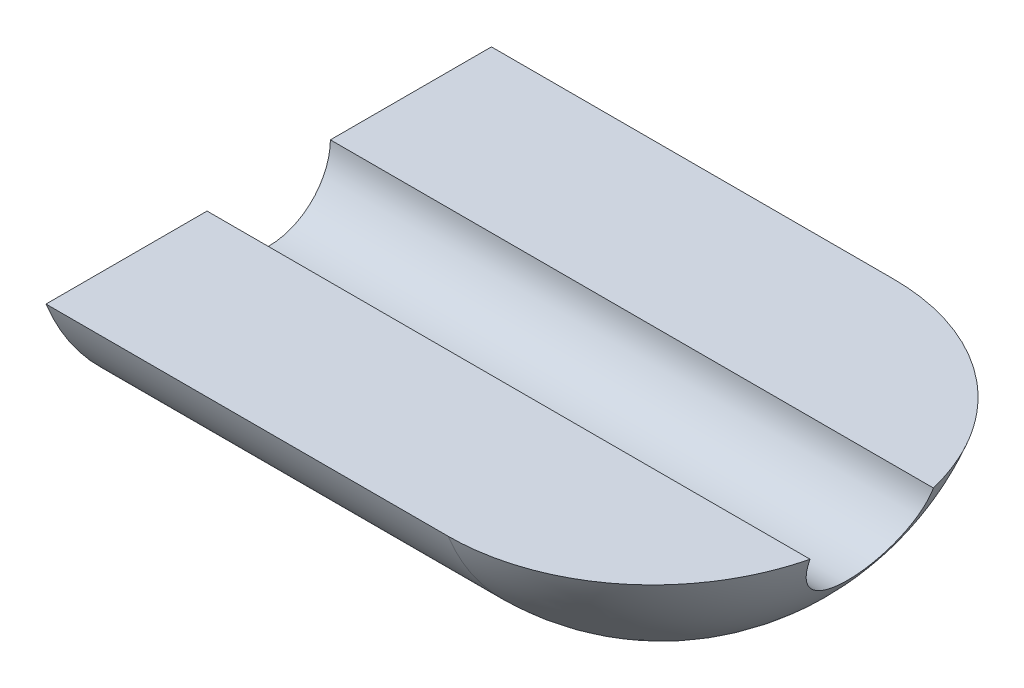
ISO-10303-21;
HEADER;
FILE_DESCRIPTION(('STEP AP214'),'2;1');
FILE_NAME('part.step','',(''),(''),'','','');
FILE_SCHEMA(('AUTOMOTIVE_DESIGN { 1 0 10303 214 1 1 1 1 }'));
ENDSEC;
DATA;
#1=APPLICATION_CONTEXT('core data for automotive mechanical design processes');
#2=APPLICATION_PROTOCOL_DEFINITION('international standard','automotive_design',2000,#1);
#3=PRODUCT_CONTEXT('',#1,'mechanical');
#4=PRODUCT('Part','Part','',(#3));
#5=PRODUCT_RELATED_PRODUCT_CATEGORY('part','',(#4));
#6=PRODUCT_DEFINITION_FORMATION('','',#4);
#7=PRODUCT_DEFINITION_CONTEXT('part definition',#1,'design');
#8=PRODUCT_DEFINITION('design','',#6,#7);
#9=PRODUCT_DEFINITION_SHAPE('','',#8);
#10=(LENGTH_UNIT() NAMED_UNIT(*) SI_UNIT(.MILLI.,.METRE.));
#11=(NAMED_UNIT(*) PLANE_ANGLE_UNIT() SI_UNIT($,.RADIAN.));
#12=(NAMED_UNIT(*) SI_UNIT($,.STERADIAN.) SOLID_ANGLE_UNIT());
#13=UNCERTAINTY_MEASURE_WITH_UNIT(LENGTH_MEASURE(1.E-05),#10,'distance_accuracy_value','');
#14=(GEOMETRIC_REPRESENTATION_CONTEXT(3) GLOBAL_UNCERTAINTY_ASSIGNED_CONTEXT((#13)) GLOBAL_UNIT_ASSIGNED_CONTEXT((#10,
#11,#12)) REPRESENTATION_CONTEXT('',''));
#15=CARTESIAN_POINT('',(0.,0.,0.));
#16=DIRECTION('',(0.,0.,1.));
#17=DIRECTION('',(1.,0.,0.));
#18=AXIS2_PLACEMENT_3D('',#15,#16,#17);
#19=CARTESIAN_POINT('',(0.,5.5,0.));
#20=DIRECTION('',(0.,1.,0.));
#21=DIRECTION('',(0.,0.,1.));
#22=AXIS2_PLACEMENT_3D('',#19,#20,#21);
#23=PLANE('',#22);
#24=DIRECTION('',(-1.,0.,0.));
#25=VECTOR('',#24,1.);
#26=CARTESIAN_POINT('',(80.01,5.5,0.634581549236986));
#27=LINE('',#26,#25);
#28=CARTESIAN_POINT('',(57.34,5.5,0.634581549236986));
#29=VERTEX_POINT('',#28);
#30=CARTESIAN_POINT('',(72.01,5.5,0.634581549236986));
#31=VERTEX_POINT('',#30);
#32=EDGE_CURVE('E101',#29,#31,#27,.F.);
#33=ORIENTED_EDGE('',*,*,#32,.F.);
#34=DIRECTION('',(0.,0.,1.));
#35=VECTOR('',#34,1.);
#36=CARTESIAN_POINT('',(57.34,5.5,17.52));
#37=LINE('',#36,#35);
#38=CARTESIAN_POINT('',(57.34,5.5,6.51005000055557));
#39=VERTEX_POINT('',#38);
#40=EDGE_CURVE('E96',#29,#39,#37,.T.);
#41=ORIENTED_EDGE('',*,*,#40,.T.);
#42=DIRECTION('',(-1.,0.,0.));
#43=VECTOR('',#42,1.);
#44=CARTESIAN_POINT('',(80.01,5.5,6.51005000055557));
#45=LINE('',#44,#43);
#46=CARTESIAN_POINT('',(79.3394800276012,5.50000000000008,6.51005000055557));
#47=VERTEX_POINT('',#46);
#48=EDGE_CURVE('E88',#39,#47,#45,.F.);
#49=ORIENTED_EDGE('',*,*,#48,.T.);
#50=CARTESIAN_POINT('',(79.6076953742566,5.5,8.76));
#51=CARTESIAN_POINT('',(79.6077023309361,5.5,9.02837036371126));
#52=CARTESIAN_POINT('',(79.5968199968479,5.5,9.29679003492493));
#53=CARTESIAN_POINT('',(79.5527067564648,5.5,9.83186942900327));
#54=CARTESIAN_POINT('',(79.5194697068977,5.5,10.0985286477334));
#55=CARTESIAN_POINT('',(79.4294253808811,5.5,10.6277164957013));
#56=CARTESIAN_POINT('',(79.3726328725868,5.5,10.8902476062178));
#57=CARTESIAN_POINT('',(79.2344893147,5.5,11.4087351942514));
#58=CARTESIAN_POINT('',(79.1531466228046,5.5,11.6646938771143));
#59=CARTESIAN_POINT('',(78.983013750841,5.5,12.1205827524817));
#60=CARTESIAN_POINT('',(78.8984169333496,5.5,12.322085331011));
#61=CARTESIAN_POINT('',(78.7128787031022,5.5,12.7174152992263));
#62=CARTESIAN_POINT('',(78.6119392085858,5.5,12.9112435863717));
#63=CARTESIAN_POINT('',(78.3941329563667,5.5,13.2897037175507));
#64=CARTESIAN_POINT('',(78.2772684806355,5.5,13.4743368740348));
#65=CARTESIAN_POINT('',(78.0282333109941,5.5,13.8329879390141));
#66=CARTESIAN_POINT('',(77.8960623306653,5.5,14.0070056487777));
#67=CARTESIAN_POINT('',(77.6169989223127,5.5,14.3433346771138));
#68=CARTESIAN_POINT('',(77.4700808258599,5.5,14.5056247081087));
#69=CARTESIAN_POINT('',(77.1627255165891,5.5,14.8168525951596));
#70=CARTESIAN_POINT('',(77.0022885637375,5.5,14.9657907078582));
#71=CARTESIAN_POINT('',(76.6690279456885,5.5,15.2491323274769));
#72=CARTESIAN_POINT('',(76.4962031277762,5.5,15.3835344788708));
#73=CARTESIAN_POINT('',(76.1394587439955,5.5,15.6367021013726));
#74=CARTESIAN_POINT('',(75.9555394586154,5.5,15.7554679675529));
#75=CARTESIAN_POINT('',(75.5840728801009,5.5,15.9728482304509));
#76=CARTESIAN_POINT('',(75.3968329147818,5.5,16.0719882105933));
#77=CARTESIAN_POINT('',(75.0145293293788,5.5,16.2540097603268));
#78=CARTESIAN_POINT('',(74.8194630805038,5.5,16.3368858109749));
#79=CARTESIAN_POINT('',(74.4230730165867,5.5,16.4856718983966));
#80=CARTESIAN_POINT('',(74.2217523050191,5.5,16.5515902035644));
#81=CARTESIAN_POINT('',(73.8141457797776,5.5,16.6660363181715));
#82=CARTESIAN_POINT('',(73.6078581681981,5.5,16.7145577261799));
#83=CARTESIAN_POINT('',(73.1942612379451,5.5,16.793357429692));
#84=CARTESIAN_POINT('',(72.9869902324859,5.5,16.8238369612243));
#85=CARTESIAN_POINT('',(72.570536297232,5.5,16.8671893941509));
#86=CARTESIAN_POINT('',(72.3613526861674,5.5,16.8800557545266));
#87=CARTESIAN_POINT('',(71.9427338287219,5.5,16.8880634521312));
#88=CARTESIAN_POINT('',(71.7332987231721,5.5,16.8832121586811));
#89=CARTESIAN_POINT('',(71.3154920568877,5.5,16.8558307089543));
#90=CARTESIAN_POINT('',(71.107121019827,5.5,16.83329256052));
#91=CARTESIAN_POINT('',(70.6936025917873,5.5,16.7707815713613));
#92=CARTESIAN_POINT('',(70.4884478643462,5.5,16.7308572466667));
#93=CARTESIAN_POINT('',(70.0823202610352,5.5,16.6339003685537));
#94=CARTESIAN_POINT('',(69.8813455343825,5.5,16.5768755669352));
#95=CARTESIAN_POINT('',(69.4848316335242,5.5,16.4461077068488));
#96=CARTESIAN_POINT('',(69.2892944258595,5.5,16.3723586859316));
#97=CARTESIAN_POINT('',(68.9051771189548,5.5,16.2087273027153));
#98=CARTESIAN_POINT('',(68.7165944904671,5.5,16.1188508768105));
#99=CARTESIAN_POINT('',(68.347239393529,5.5,15.9234025387041));
#100=CARTESIAN_POINT('',(68.1664841552859,5.5,15.8177980672832));
#101=CARTESIAN_POINT('',(67.8145236883116,5.5,15.5918543659582));
#102=CARTESIAN_POINT('',(67.6433150611271,5.5,15.4715204289025));
#103=CARTESIAN_POINT('',(67.3114651731751,5.5,15.2169123290138));
#104=CARTESIAN_POINT('',(67.1508291625498,5.5,15.0826313244176));
#105=CARTESIAN_POINT('',(66.8413450962586,5.5,14.8012177565938));
#106=CARTESIAN_POINT('',(66.6924929654953,5.5,14.6540896734813));
#107=CARTESIAN_POINT('',(66.4062408461907,5.5,14.3466972848664));
#108=CARTESIAN_POINT('',(66.2689511346516,5.5,14.1863303002828));
#109=CARTESIAN_POINT('',(66.0081338510629,5.5,13.8547765902544));
#110=CARTESIAN_POINT('',(65.8846062623249,5.5,13.6835898779304));
#111=CARTESIAN_POINT('',(65.6520782342032,5.5,13.3317624329755));
#112=CARTESIAN_POINT('',(65.5430697318146,5.5,13.1511270258507));
#113=CARTESIAN_POINT('',(65.3400205895639,5.5,12.7816372852848));
#114=CARTESIAN_POINT('',(65.2459801640461,5.5,12.5927828341954));
#115=CARTESIAN_POINT('',(65.0708865856775,5.5,12.2030979503389));
#116=CARTESIAN_POINT('',(64.9902453279674,5.5,12.0020825936391));
#117=CARTESIAN_POINT('',(64.8451581363816,5.5,11.5943073668426));
#118=CARTESIAN_POINT('',(64.7807121686357,5.5,11.3875475087607));
#119=CARTESIAN_POINT('',(64.6677422936703,5.5,10.9694893295982));
#120=CARTESIAN_POINT('',(64.6192364400913,5.5,10.7581861492807));
#121=CARTESIAN_POINT('',(64.5377591243811,5.5,10.3326116361911));
#122=CARTESIAN_POINT('',(64.504788962277,5.5,10.1183400565673));
#123=CARTESIAN_POINT('',(64.4511250633583,5.5,9.66600848738885));
#124=CARTESIAN_POINT('',(64.4320336620135,5.5,9.42775885013463));
#125=CARTESIAN_POINT('',(64.4112355544718,5.5,8.950497483218));
#126=CARTESIAN_POINT('',(64.4095305259844,5.5,8.71148568223609));
#127=CARTESIAN_POINT('',(64.4234356959219,5.5,8.23385032167484));
#128=CARTESIAN_POINT('',(64.4390533936272,5.5,7.99522697506655));
#129=CARTESIAN_POINT('',(64.4882326155228,5.5,7.51982110574651));
#130=CARTESIAN_POINT('',(64.5217941617526,5.5,7.28303858529612));
#131=CARTESIAN_POINT('',(64.6136406387275,5.5,6.78064967739285));
#132=CARTESIAN_POINT('',(64.674682353132,5.5,6.51553765491161));
#133=CARTESIAN_POINT('',(64.8220773784337,5.5,5.99238154436173));
#134=CARTESIAN_POINT('',(64.9084329751479,5.5,5.73433809687986));
#135=CARTESIAN_POINT('',(65.1065802623455,5.5,5.22855696072308));
#136=CARTESIAN_POINT('',(65.2183393370527,5.5,4.98080653500178));
#137=CARTESIAN_POINT('',(65.4669030781019,5.5,4.49821469081062));
#138=CARTESIAN_POINT('',(65.6037033261558,5.5,4.26337100455301));
#139=CARTESIAN_POINT('',(65.878747243824,5.5,3.84380922373616));
#140=CARTESIAN_POINT('',(66.0136381698243,5.5,3.65688444817034));
#141=CARTESIAN_POINT('',(66.2997775509953,5.5,3.29600676983187));
#142=CARTESIAN_POINT('',(66.451024603721,5.5,3.12205275704747));
#143=CARTESIAN_POINT('',(66.7687670735896,5.5,2.78864161133379));
#144=CARTESIAN_POINT('',(66.9352641855355,5.5,2.6291860936165));
#145=CARTESIAN_POINT('',(67.2821807842605,5.5,2.32621389276423));
#146=CARTESIAN_POINT('',(67.4625998136151,5.5,2.18269668633075));
#147=CARTESIAN_POINT('',(67.8220794013123,5.5,1.92285940096926));
#148=CARTESIAN_POINT('',(68.0002554609646,5.5,1.80531333047753));
#149=CARTESIAN_POINT('',(68.3660042895672,5.5,1.58589093529027));
#150=CARTESIAN_POINT('',(68.5535766383489,5.5,1.48401391075836));
#151=CARTESIAN_POINT('',(68.9366936647261,5.5,1.29674316231642));
#152=CARTESIAN_POINT('',(69.1322354926056,5.5,1.21134360797376));
#153=CARTESIAN_POINT('',(69.5299283138085,5.5,1.05763694765287));
#154=CARTESIAN_POINT('',(69.7320793303315,5.5,0.989329901679742));
#155=CARTESIAN_POINT('',(70.138166052646,5.5,0.871302987910124));
#156=CARTESIAN_POINT('',(70.3420191294219,5.5,0.821298631703383));
#157=CARTESIAN_POINT('',(70.7532958124504,5.5,0.738695237554467));
#158=CARTESIAN_POINT('',(70.9607206183616,5.5,0.706102170182909));
#159=CARTESIAN_POINT('',(71.3775197773859,5.5,0.658597737653936));
#160=CARTESIAN_POINT('',(71.586893506247,5.5,0.643680894651801));
#161=CARTESIAN_POINT('',(72.0062300275939,5.5,0.631619167096186));
#162=CARTESIAN_POINT('',(72.2161930088503,5.5,0.634480838940165));
#163=CARTESIAN_POINT('',(72.6341203636616,5.5,0.657913888133056));
#164=CARTESIAN_POINT('',(72.8420894932414,5.5,0.678400544248534));
#165=CARTESIAN_POINT('',(73.2556400806789,5.5,0.736830146422631));
#166=CARTESIAN_POINT('',(73.461220620769,5.5,0.774779588697626));
#167=CARTESIAN_POINT('',(73.8683617984528,5.5,0.86783577784102));
#168=CARTESIAN_POINT('',(74.0699242289981,5.5,0.922934681317626));
#169=CARTESIAN_POINT('',(74.4677902227804,5.5,1.04991817969198));
#170=CARTESIAN_POINT('',(74.6640913713373,5.5,1.12181033967495));
#171=CARTESIAN_POINT('',(75.0500604968501,5.5,1.28187986833122));
#172=CARTESIAN_POINT('',(75.2397248589599,5.5,1.37006595249154));
#173=CARTESIAN_POINT('',(75.6108980372724,5.5,1.56200434622037));
#174=CARTESIAN_POINT('',(75.792410448237,5.5,1.66574970527858));
#175=CARTESIAN_POINT('',(76.1461865005296,5.5,1.8881182409424));
#176=CARTESIAN_POINT('',(76.3184462108656,5.5,2.00674767072656));
#177=CARTESIAN_POINT('',(76.6523963730252,5.5,2.25793041989117));
#178=CARTESIAN_POINT('',(76.8140905887795,5.5,2.39047873634663));
#179=CARTESIAN_POINT('',(77.1268758837295,5.5,2.66943382448424));
#180=CARTESIAN_POINT('',(77.2778940126476,5.5,2.8159223858914));
#181=CARTESIAN_POINT('',(77.5671613024183,5.5,3.12090630836931));
#182=CARTESIAN_POINT('',(77.7054148244894,5.5,3.27939753461002));
#183=CARTESIAN_POINT('',(77.9683921606876,5.5,3.60730864427168));
#184=CARTESIAN_POINT('',(78.0931118157995,5.5,3.77673186177828));
#185=CARTESIAN_POINT('',(78.3282223198821,5.5,4.12515830649314));
#186=CARTESIAN_POINT('',(78.4386177297412,5.5,4.30415845860804));
#187=CARTESIAN_POINT('',(78.6466065165115,5.5,4.67407731785711));
#188=CARTESIAN_POINT('',(78.7439066423087,5.5,4.86516084157995));
#189=CARTESIAN_POINT('',(78.9227413170203,5.5,5.25456166631871));
#190=CARTESIAN_POINT('',(79.0042753453133,5.5,5.45287920595627));
#191=CARTESIAN_POINT('',(79.1514241647374,5.5,5.85519641806213));
#192=CARTESIAN_POINT('',(79.2170482246808,5.5,6.05919270460763));
#193=CARTESIAN_POINT('',(79.3325966782146,5.5,6.47151996653132));
#194=CARTESIAN_POINT('',(79.3825225664344,5.5,6.67985052722657));
#195=CARTESIAN_POINT('',(79.4867765579149,5.5,7.19709082030436));
#196=CARTESIAN_POINT('',(79.5323912371054,5.5,7.50780060457313));
#197=CARTESIAN_POINT('',(79.5777172244861,5.5,7.97606786034412));
#198=CARTESIAN_POINT('',(79.5889763225878,5.5,8.1326347839779));
#199=CARTESIAN_POINT('',(79.6039631498456,5.5,8.44612886471213));
#200=CARTESIAN_POINT('',(79.6076913059642,5.5,8.60305600088548));
#201=CARTESIAN_POINT('',(79.6076953742566,5.5,8.76));
#202=B_SPLINE_CURVE_WITH_KNOTS('',3,(#50,#51,#52,#53,#54,#55,#56,#57,#58,#59,#60,#61,#62,#63,
#64,#65,#66,#67,#68,#69,#70,#71,#72,#73,#74,#75,#76,#77,#78,#79,#80,#81,#82,#83,#84,#85,#86,#87,
#88,#89,#90,#91,#92,#93,#94,#95,#96,#97,#98,#99,#100,#101,#102,#103,#104,#105,#106,#107,#108,
#109,#110,#111,#112,#113,#114,#115,#116,#117,#118,#119,#120,#121,#122,#123,#124,#125,#126,#127,
#128,#129,#130,#131,#132,#133,#134,#135,#136,#137,#138,#139,#140,#141,#142,#143,#144,#145,#146,
#147,#148,#149,#150,#151,#152,#153,#154,#155,#156,#157,#158,#159,#160,#161,#162,#163,#164,#165,
#166,#167,#168,#169,#170,#171,#172,#173,#174,#175,#176,#177,#178,#179,#180,#181,#182,#183,#184,
#185,#186,#187,#188,#189,#190,#191,#192,#193,#194,#195,#196,#197,#198,#199,#200,#201),
.UNSPECIFIED.,.T.,.F.,(4,2,2,2,2,2,2,2,2,2,2,2,2,2,2,2,2,2,2,2,2,2,2,2,2,2,2,2,2,2,2,2,2,2,2,2,
2,2,2,2,2,2,2,2,2,2,2,2,2,2,2,2,2,2,2,2,2,2,2,2,2,2,2,2,2,2,2,2,2,2,2,2,2,2,2,4),(0.,
0.80496675937522,1.61015482112021,2.41483882939646,3.21924920494103,3.87416733633762,
4.52900865165891,5.1837562299196,5.83851606193625,6.49443599233153,7.15034331232582,
7.80631174519797,8.46226360093292,9.09710181674111,9.73215508516452,10.3668981197933,
11.0018744778508,11.6296280228386,12.2576146340159,12.8853400758669,13.5133493314057,
14.1396172488814,14.7656017015312,15.3918096794026,16.0177876252193,16.6450799225662,
17.2721474684102,17.8995240895493,18.5266827950546,19.1592699321369,19.7918563021188,
20.42408989476,21.0563325402399,21.7053891303664,22.3544443630746,23.0042321969112,
23.6540743953655,24.3704437794031,25.0868822893209,25.8036310778276,26.5203807466862,
27.3353065022412,28.1503058674153,28.9642646987922,29.7780800526985,30.4687126265365,
31.1592860294354,31.8499362719834,32.5405638318812,33.1801653827535,33.8197383584015,
34.4590846091132,35.0984331042873,35.7273732740088,36.3565289777532,36.9854896557249,
37.6146822968808,38.2408672745985,38.867285383828,39.493417417545,40.1198320592468,
40.7465827401491,41.3730542735476,41.9997898905393,42.6263010033743,43.2567458928364,
43.8869745780511,44.5173963900285,45.1476169783934,45.7901870119126,46.4327782604829,
47.0749942444751,47.7171490642893,48.6573740877274,49.1281483703442,49.5988959619319),.UNSPECIFIED.);
#203=EDGE_CURVE('E60',#31,#47,#202,.T.);
#204=ORIENTED_EDGE('',*,*,#203,.F.);
#205=EDGE_LOOP('',(#33,#41,#49,#204));
#206=FACE_BOUND('',#205,.T.);
#207=ADVANCED_FACE('F42',(#206),#23,.T.);
#208=DIRECTION('',(-1.,0.,0.));
#209=VECTOR('',#208,1.);
#210=CARTESIAN_POINT('',(80.01,5.5,16.885418450763));
#211=LINE('',#210,#209);
#212=CARTESIAN_POINT('',(72.01,5.5,16.885418450763));
#213=VERTEX_POINT('',#212);
#214=CARTESIAN_POINT('',(57.34,5.5,16.885418450763));
#215=VERTEX_POINT('',#214);
#216=EDGE_CURVE('E103',#213,#215,#211,.T.);
#217=ORIENTED_EDGE('',*,*,#216,.F.);
#218=CARTESIAN_POINT('',(79.3394800276087,5.50000000002092,11.0099499994446));
#219=VERTEX_POINT('',#218);
#220=EDGE_CURVE('E68',#219,#213,#202,.T.);
#221=ORIENTED_EDGE('',*,*,#220,.F.);
#222=DIRECTION('',(-1.,0.,0.));
#223=VECTOR('',#222,1.);
#224=CARTESIAN_POINT('',(80.01,5.5,11.0099499994444));
#225=LINE('',#224,#223);
#226=CARTESIAN_POINT('',(57.34,5.5,11.0099499994444));
#227=VERTEX_POINT('',#226);
#228=EDGE_CURVE('E47',#219,#227,#225,.T.);
#229=ORIENTED_EDGE('',*,*,#228,.T.);
#230=EDGE_CURVE('E97',#227,#215,#37,.T.);
#231=ORIENTED_EDGE('',*,*,#230,.T.);
#232=EDGE_LOOP('',(#217,#221,#229,#231));
#233=FACE_BOUND('',#232,.T.);
#234=ADVANCED_FACE('F122',(#233),#23,.T.);
#235=CARTESIAN_POINT('',(80.01,8.76,8.76));
#236=DIRECTION('',(-1.,0.,0.));
#237=DIRECTION('',(0.,0.,1.));
#238=AXIS2_PLACEMENT_3D('',#235,#236,#237);
#239=CYLINDRICAL_SURFACE('',#238,8.755);
#240=CARTESIAN_POINT('',(57.34,8.76,8.76));
#241=DIRECTION('',(1.,0.,0.));
#242=DIRECTION('',(0.,0.,-1.));
#243=AXIS2_PLACEMENT_3D('',#240,#241,#242);
#244=CIRCLE('',#243,8.755);
#245=EDGE_CURVE('E104',#215,#29,#244,.T.);
#246=ORIENTED_EDGE('',*,*,#245,.T.);
#247=ORIENTED_EDGE('',*,*,#32,.T.);
#248=CARTESIAN_POINT('',(72.01,8.76,8.76));
#249=DIRECTION('',(-1.,0.,0.));
#250=DIRECTION('',(0.,0.,1.));
#251=AXIS2_PLACEMENT_3D('',#248,#249,#250);
#252=CIRCLE('',#251,8.755);
#253=EDGE_CURVE('E92',#31,#213,#252,.T.);
#254=ORIENTED_EDGE('',*,*,#253,.T.);
#255=ORIENTED_EDGE('',*,*,#216,.T.);
#256=EDGE_LOOP('',(#246,#247,#254,#255));
#257=FACE_BOUND('',#256,.T.);
#258=ADVANCED_FACE('F115',(#257),#239,.T.);
#259=CARTESIAN_POINT('',(72.01,8.76,8.76));
#260=DIRECTION('',(-1.,0.,0.));
#261=DIRECTION('',(0.,0.,1.));
#262=AXIS2_PLACEMENT_3D('',#259,#260,#261);
#263=DEGENERATE_TOROIDAL_SURFACE('',#262,0.755000000000002,8.,.T.);
#264=CARTESIAN_POINT('',(78.5789059169986,3.55478118804774,7.65544479120848));
#265=CARTESIAN_POINT('',(78.605839459138,3.61831859679219,7.54270065446902));
#266=CARTESIAN_POINT('',(78.63655842933,3.69129092952143,7.43602273848343));
#267=CARTESIAN_POINT('',(78.7039931930089,3.85327831508842,7.23761595721164));
#268=CARTESIAN_POINT('',(78.7407214814934,3.94232683543079,7.1459190528425));
#269=CARTESIAN_POINT('',(78.8184160071089,4.13311898973248,6.97987855332304));
#270=CARTESIAN_POINT('',(78.8593667810448,4.23481656531346,6.90547467436619));
#271=CARTESIAN_POINT('',(78.944097737763,4.44821153575595,6.77503018936737));
#272=CARTESIAN_POINT('',(78.9878770131627,4.55990572809203,6.71898372894688));
#273=CARTESIAN_POINT('',(79.0792921272365,4.79670959331126,6.62371717902816));
#274=CARTESIAN_POINT('',(79.1270087918038,4.92221762905361,6.58556297968062));
#275=CARTESIAN_POINT('',(79.2225561072378,5.17793411208287,6.53155362191626));
#276=CARTESIAN_POINT('',(79.2703867890252,5.30814401377907,6.51570542498928));
#277=CARTESIAN_POINT('',(79.3660901227817,5.57364180122751,6.50673449964489));
#278=CARTESIAN_POINT('',(79.4139237800088,5.70896745441757,6.51428401935291));
#279=CARTESIAN_POINT('',(79.5066653595392,5.97705870789151,6.55379171411631));
#280=CARTESIAN_POINT('',(79.551573455693,6.10982445996589,6.58574843734406));
#281=CARTESIAN_POINT('',(79.6361216687739,6.36604673985358,6.67285928606061));
#282=CARTESIAN_POINT('',(79.6758497344336,6.48963698002031,6.72753277755066));
#283=CARTESIAN_POINT('',(79.7497205168644,6.72627179119074,6.85904595678462));
#284=CARTESIAN_POINT('',(79.783864736191,6.83931919563255,6.93587966601223));
#285=CARTESIAN_POINT('',(79.8436544336518,7.04490395373329,7.10511671942666));
#286=CARTESIAN_POINT('',(79.8696625054336,7.13822474558416,7.19643913978371));
#287=CARTESIAN_POINT('',(79.9147667938074,7.30827191662033,7.39481529792415));
#288=CARTESIAN_POINT('',(79.9338672823515,7.3850085403235,7.50185925501838));
#289=CARTESIAN_POINT('',(79.9639372353908,7.51511272017672,7.72200900046519));
#290=CARTESIAN_POINT('',(79.9753112179505,7.56957061851651,7.83441190088664));
#291=CARTESIAN_POINT('',(79.9879545104463,7.63680349985297,8.00876575408987));
#292=CARTESIAN_POINT('',(79.9914332745403,7.65681165451583,8.06787200220377));
#293=CARTESIAN_POINT('',(79.9971175845861,7.69187081349112,8.18761950070153));
#294=CARTESIAN_POINT('',(79.9993229997885,7.70692130867511,8.24826090805088));
#295=CARTESIAN_POINT('',(80.0026873749238,7.73170288129699,8.3695008009825));
#296=CARTESIAN_POINT('',(80.0038645192564,7.74152514192832,8.43008027217401));
#297=CARTESIAN_POINT('',(80.0055231238225,7.75618746422263,8.55182673423669));
#298=CARTESIAN_POINT('',(80.0060048350802,7.76102932343534,8.61299350508601));
#299=CARTESIAN_POINT('',(80.0064709782871,7.76570267712051,8.73553837663846));
#300=CARTESIAN_POINT('',(80.006455259607,7.7655326539211,8.79691653572714));
#301=CARTESIAN_POINT('',(80.0059189291161,7.76018080135508,8.91945181223275));
#302=CARTESIAN_POINT('',(80.0053983072238,7.75499887191461,8.98060892521154));
#303=CARTESIAN_POINT('',(80.0036205988847,7.73947123975293,9.10375679998924));
#304=CARTESIAN_POINT('',(80.002346084585,7.72900422802532,9.16573218717924));
#305=CARTESIAN_POINT('',(79.9987498885441,7.7029412100674,9.28854633663641));
#306=CARTESIAN_POINT('',(79.9964282063026,7.68734520138705,9.34938509836063));
#307=CARTESIAN_POINT('',(79.9874694165546,7.6330360567898,9.52947693642395));
#308=CARTESIAN_POINT('',(79.978837737472,7.58678112544927,9.64646796609264));
#309=CARTESIAN_POINT('',(79.9553834789758,7.47678391398929,9.86861517758481));
#310=CARTESIAN_POINT('',(79.9406704437897,7.41335759179981,9.97394091791288));
#311=CARTESIAN_POINT('',(79.9050583932059,7.27083443472209,10.1722503605702));
#312=CARTESIAN_POINT('',(79.8841580436227,7.19173422125253,10.2652313947107));
#313=CARTESIAN_POINT('',(79.8366705282191,7.02051564810934,10.4364797432406));
#314=CARTESIAN_POINT('',(79.8100857341505,6.92840272322247,10.5147531686541));
#315=CARTESIAN_POINT('',(79.751971543807,6.73393734259454,10.6550119990622));
#316=CARTESIAN_POINT('',(79.7204416942165,6.63158394841652,10.716995909394));
#317=CARTESIAN_POINT('',(79.6517120731278,6.41444325466874,10.826145367069));
#318=CARTESIAN_POINT('',(79.6143145980874,6.29929676660352,10.8724708859912));
#319=CARTESIAN_POINT('',(79.5361044163861,6.06404286321877,10.9454594808364));
#320=CARTESIAN_POINT('',(79.495290698415,5.94393398424947,10.9721167112719));
#321=CARTESIAN_POINT('',(79.4088900687765,5.69471960443077,11.0065367824052));
#322=CARTESIAN_POINT('',(79.3631636021956,5.56549755430166,11.0131087205365));
#323=CARTESIAN_POINT('',(79.2704247552626,5.30827534178892,11.004178583722));
#324=CARTESIAN_POINT('',(79.223412050185,5.18027549917594,10.9886708831336));
#325=CARTESIAN_POINT('',(79.1275526431689,4.92362232890201,10.9350050441575));
#326=CARTESIAN_POINT('',(79.0787090658493,4.79515390637124,10.895951879624));
#327=CARTESIAN_POINT('',(78.9827294961199,4.54661842168547,10.7953653377815));
#328=CARTESIAN_POINT('',(78.9355937209801,4.42655242670714,10.7338291110925));
#329=CARTESIAN_POINT('',(78.8448247326566,4.19850444857138,10.5896230822032));
#330=CARTESIAN_POINT('',(78.8011883511843,4.09051149896713,10.5069726868278));
#331=CARTESIAN_POINT('',(78.7192647560674,3.89012668486691,10.3223161374283));
#332=CARTESIAN_POINT('',(78.6809761319197,3.79773070522997,10.2203151040534));
#333=CARTESIAN_POINT('',(78.6135256312266,3.63647368283991,10.0052911315327));
#334=CARTESIAN_POINT('',(78.5839927486118,3.56663880384132,9.89311692214511));
#335=CARTESIAN_POINT('',(78.5331610439195,3.44720149191639,9.65677501295003));
#336=CARTESIAN_POINT('',(78.5118567846506,3.397585697716,9.53261530078678));
#337=CARTESIAN_POINT('',(78.4801596752059,3.3240252215956,9.28657528582217));
#338=CARTESIAN_POINT('',(78.4690298640373,3.29834345695744,9.16530818001026));
#339=CARTESIAN_POINT('',(78.4555532174004,3.26726789702313,8.91969980397308));
#340=CARTESIAN_POINT('',(78.4532052329832,3.26187144774704,8.79535893803854));
#341=CARTESIAN_POINT('',(78.457315864641,3.27133795244692,8.55458328076953));
#342=CARTESIAN_POINT('',(78.4632916047208,3.28509004451622,8.43809363221508));
#343=CARTESIAN_POINT('',(78.4828609801112,3.33030851532863,8.20938462635295));
#344=CARTESIAN_POINT('',(78.4964448648934,3.36175222089718,8.09715999922047));
#345=CARTESIAN_POINT('',(78.5225143791647,3.42246788569035,7.93077772249109));
#346=CARTESIAN_POINT('',(78.5325426664958,3.44587838039445,7.87400896589198));
#347=CARTESIAN_POINT('',(78.5544035219926,3.49709070069692,7.7628611214418));
#348=CARTESIAN_POINT('',(78.5662358736047,3.52489199925239,7.70848174778518));
#349=CARTESIAN_POINT('',(78.5789059169986,3.55478118804774,7.65544479120848));
#350=B_SPLINE_CURVE_WITH_KNOTS('',3,(#264,#265,#266,#267,#268,#269,#270,#271,#272,#273,#274,
#275,#276,#277,#278,#279,#280,#281,#282,#283,#284,#285,#286,#287,#288,#289,#290,#291,#292,#293,
#294,#295,#296,#297,#298,#299,#300,#301,#302,#303,#304,#305,#306,#307,#308,#309,#310,#311,#312,
#313,#314,#315,#316,#317,#318,#319,#320,#321,#322,#323,#324,#325,#326,#327,#328,#329,#330,#331,
#332,#333,#334,#335,#336,#337,#338,#339,#340,#341,#342,#343,#344,#345,#346,#347,#348,#349),
.UNSPECIFIED.,.T.,.F.,(4,2,2,2,2,2,2,2,2,2,2,2,2,2,2,2,2,2,2,2,2,2,2,2,2,2,2,2,2,2,2,2,2,2,2,2,
2,2,2,2,2,2,4),(0.,0.396318478653314,0.793471734629411,1.18921901575279,1.58483996564253,
2.00171776753732,2.41872564417638,2.84782465410954,3.27689814168875,3.69732174714863,
4.11763203413745,4.51496236892002,4.9120465552964,5.28628935573486,5.47359242617093,
5.66091472576404,5.84485306550702,6.02872499404603,6.21265260228694,6.39658388312743,
6.58494310894441,6.77330242473758,7.14953632708907,7.51926959963163,7.88908265679571,
8.25874171488332,8.62843467962131,9.01562205526782,9.40292445811801,9.81278466822066,
10.2227493247641,10.6493773411318,11.0760594447572,11.5023507710857,11.9285294473213,
12.3325511699673,12.7363054703651,13.1077381386498,13.4791222097522,13.8298361408016,
14.1801016252003,14.3665596351906,14.5529952809879),.UNSPECIFIED.);
#351=EDGE_CURVE('E11',#219,#47,#350,.T.);
#352=ORIENTED_EDGE('',*,*,#351,.F.);
#353=ORIENTED_EDGE('',*,*,#220,.T.);
#354=ORIENTED_EDGE('',*,*,#253,.F.);
#355=ORIENTED_EDGE('',*,*,#203,.T.);
#356=EDGE_LOOP('',(#352,#353,#354,#355));
#357=FACE_BOUND('',#356,.T.);
#358=ADVANCED_FACE('F90',(#357),#263,.T.);
#359=CARTESIAN_POINT('',(57.34,12.77,17.52));
#360=DIRECTION('',(1.,0.,0.));
#361=DIRECTION('',(0.,0.,-1.));
#362=AXIS2_PLACEMENT_3D('',#359,#360,#361);
#363=PLANE('',#362);
#364=ORIENTED_EDGE('',*,*,#40,.F.);
#365=ORIENTED_EDGE('',*,*,#245,.F.);
#366=ORIENTED_EDGE('',*,*,#230,.F.);
#367=CARTESIAN_POINT('',(57.34,5.515,8.76));
#368=DIRECTION('',(1.,0.,0.));
#369=DIRECTION('',(0.,0.,-1.));
#370=AXIS2_PLACEMENT_3D('',#367,#368,#369);
#371=CIRCLE('',#370,2.25);
#372=EDGE_CURVE('E52',#227,#39,#371,.T.);
#373=ORIENTED_EDGE('',*,*,#372,.T.);
#374=EDGE_LOOP('',(#364,#365,#366,#373));
#375=FACE_BOUND('',#374,.T.);
#376=ADVANCED_FACE('F114',(#375),#363,.F.);
#377=CARTESIAN_POINT('',(80.01,5.515,8.76));
#378=DIRECTION('',(-1.,0.,0.));
#379=DIRECTION('',(0.,0.,1.));
#380=AXIS2_PLACEMENT_3D('',#377,#378,#379);
#381=CYLINDRICAL_SURFACE('',#380,2.25);
#382=ORIENTED_EDGE('',*,*,#48,.F.);
#383=ORIENTED_EDGE('',*,*,#372,.F.);
#384=ORIENTED_EDGE('',*,*,#228,.F.);
#385=ORIENTED_EDGE('',*,*,#351,.T.);
#386=EDGE_LOOP('',(#382,#383,#384,#385));
#387=FACE_BOUND('',#386,.T.);
#388=ADVANCED_FACE('F44',(#387),#381,.F.);
#389=CLOSED_SHELL('',(#207,#234,#258,#358,#376,#388));
#390=MANIFOLD_SOLID_BREP('B2',#389);
#391=ADVANCED_BREP_SHAPE_REPRESENTATION('',(#18,#390),#14);
#392=SHAPE_DEFINITION_REPRESENTATION(#9,#391);
ENDSEC;
END-ISO-10303-21;
